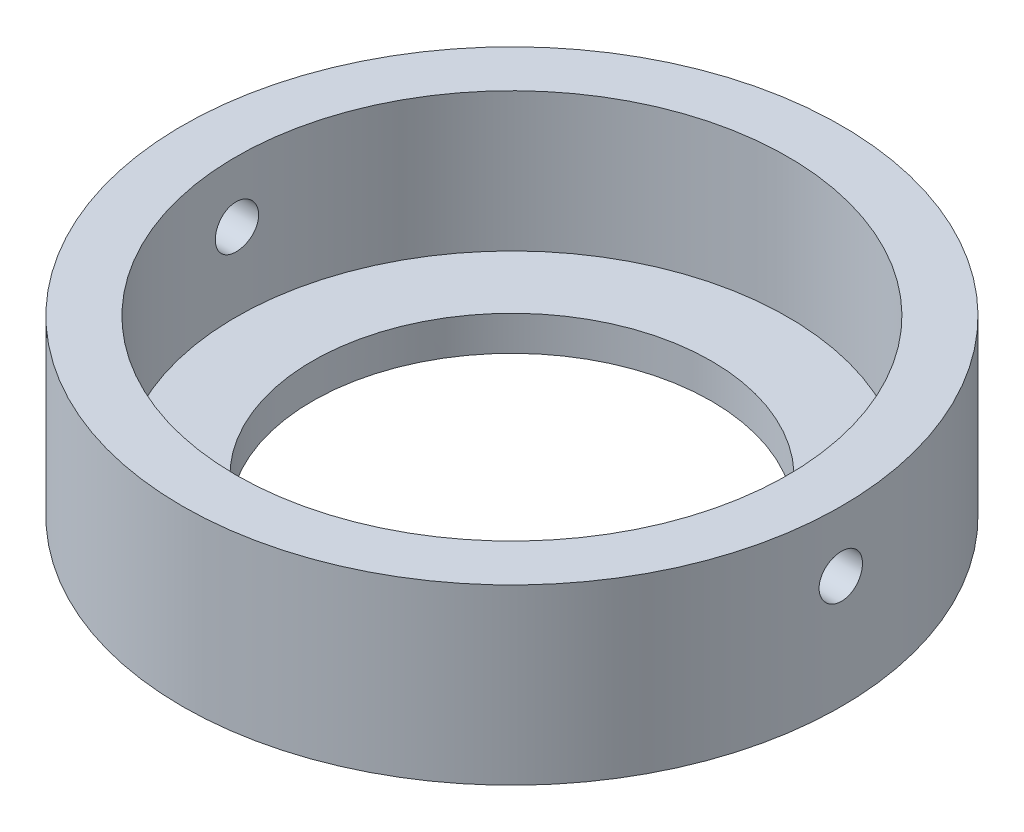
ISO-10303-21;
HEADER;
FILE_DESCRIPTION(('STEP AP214'),'2;1');
FILE_NAME('part.step','',(''),(''),'','','');
FILE_SCHEMA(('AUTOMOTIVE_DESIGN { 1 0 10303 214 1 1 1 1 }'));
ENDSEC;
DATA;
#1=APPLICATION_CONTEXT('core data for automotive mechanical design processes');
#2=APPLICATION_PROTOCOL_DEFINITION('international standard','automotive_design',2000,#1);
#3=PRODUCT_CONTEXT('',#1,'mechanical');
#4=PRODUCT('Part','Part','',(#3));
#5=PRODUCT_RELATED_PRODUCT_CATEGORY('part','',(#4));
#6=PRODUCT_DEFINITION_FORMATION('','',#4);
#7=PRODUCT_DEFINITION_CONTEXT('part definition',#1,'design');
#8=PRODUCT_DEFINITION('design','',#6,#7);
#9=PRODUCT_DEFINITION_SHAPE('','',#8);
#10=(LENGTH_UNIT() NAMED_UNIT(*) SI_UNIT(.MILLI.,.METRE.));
#11=(NAMED_UNIT(*) PLANE_ANGLE_UNIT() SI_UNIT($,.RADIAN.));
#12=(NAMED_UNIT(*) SI_UNIT($,.STERADIAN.) SOLID_ANGLE_UNIT());
#13=UNCERTAINTY_MEASURE_WITH_UNIT(LENGTH_MEASURE(1.E-05),#10,'distance_accuracy_value','');
#14=(GEOMETRIC_REPRESENTATION_CONTEXT(3) GLOBAL_UNCERTAINTY_ASSIGNED_CONTEXT((#13)) GLOBAL_UNIT_ASSIGNED_CONTEXT((#10,
#11,#12)) REPRESENTATION_CONTEXT('',''));
#15=CARTESIAN_POINT('',(0.,0.,0.));
#16=DIRECTION('',(0.,0.,1.));
#17=DIRECTION('',(1.,0.,0.));
#18=AXIS2_PLACEMENT_3D('',#15,#16,#17);
#19=CARTESIAN_POINT('',(0.,2.,0.));
#20=DIRECTION('',(0.,-1.,0.));
#21=DIRECTION('',(0.,0.,-1.));
#22=AXIS2_PLACEMENT_3D('',#19,#20,#21);
#23=CYLINDRICAL_SURFACE('',#22,19.);
#24=CARTESIAN_POINT('',(18.9588369896468,6.5,1.24999999999999));
#25=CARTESIAN_POINT('',(18.9588375396088,6.57013148410964,1.24999691698055));
#26=CARTESIAN_POINT('',(18.9592303148243,6.64031188548215,1.24407805299881));
#27=CARTESIAN_POINT('',(18.9607591328196,6.77873428538638,1.22055180266377));
#28=CARTESIAN_POINT('',(18.9618960375227,6.84697394019587,1.20293086147641));
#29=CARTESIAN_POINT('',(18.9647837839129,6.9794897783657,1.1565092682008));
#30=CARTESIAN_POINT('',(18.9665342981522,7.04376805421409,1.12771457801599));
#31=CARTESIAN_POINT('',(18.9704516079821,7.16656232997985,1.05977264730639));
#32=CARTESIAN_POINT('',(18.9726183091025,7.22507963302704,1.02062775541117));
#33=CARTESIAN_POINT('',(18.9771278975969,7.33480407260864,0.9330259586646));
#34=CARTESIAN_POINT('',(18.9794710371753,7.38600042957064,0.884555563854293));
#35=CARTESIAN_POINT('',(18.984067145466,7.47953738585654,0.779706632804728));
#36=CARTESIAN_POINT('',(18.9863201103897,7.52187761340709,0.723327764739887));
#37=CARTESIAN_POINT('',(18.9904842240195,7.59653392936497,0.604200969092946));
#38=CARTESIAN_POINT('',(18.9923950661852,7.6288410469995,0.541447407929066));
#39=CARTESIAN_POINT('',(18.9956569629665,7.68245663362515,0.411392049451877));
#40=CARTESIAN_POINT('',(18.9970080241015,7.70376523070846,0.344090305118454));
#41=CARTESIAN_POINT('',(18.998996383403,7.73474885133426,0.206953324972159));
#42=CARTESIAN_POINT('',(18.9996347217425,7.74444083010752,0.137121935206073));
#43=CARTESIAN_POINT('',(19.0001292164116,7.75196846233493,-0.00317924369410391));
#44=CARTESIAN_POINT('',(18.9999853823551,7.74980426151517,-0.0736490249710013));
#45=CARTESIAN_POINT('',(18.9989326057468,7.73369493743142,-0.213111746980412));
#46=CARTESIAN_POINT('',(18.9980248476562,7.71976805204224,-0.282106804548808));
#47=CARTESIAN_POINT('',(18.9955477714651,7.68055700174088,-0.416777761157238));
#48=CARTESIAN_POINT('',(18.9939784491166,7.65527276390538,-0.482453638882459));
#49=CARTESIAN_POINT('',(18.9903528796175,7.59404412894595,-0.608680412720544));
#50=CARTESIAN_POINT('',(18.98829625581,7.55809148028618,-0.669227295016875));
#51=CARTESIAN_POINT('',(18.9839274937888,7.47655258861317,-0.783433543890818));
#52=CARTESIAN_POINT('',(18.9816153523789,7.43096622508746,-0.837092824294812));
#53=CARTESIAN_POINT('',(18.9769905476197,7.33135095910624,-0.936107153052133));
#54=CARTESIAN_POINT('',(18.9746778915818,7.27730622437404,-0.981446274902408));
#55=CARTESIAN_POINT('',(18.970317163269,7.1623637752548,-1.06241044516599));
#56=CARTESIAN_POINT('',(18.9682690911121,7.10146605781396,-1.0980354892505));
#57=CARTESIAN_POINT('',(18.964668845539,6.9745360356885,-1.15855917855933));
#58=CARTESIAN_POINT('',(18.9631167041369,6.90850339986849,-1.18345713134759));
#59=CARTESIAN_POINT('',(18.9606844759929,6.77318270284996,-1.22180877024509));
#60=CARTESIAN_POINT('',(18.9598043804859,6.70389468412224,-1.23526260561433));
#61=CARTESIAN_POINT('',(18.9588171416418,6.56416903948201,-1.25032421791206));
#62=CARTESIAN_POINT('',(18.9587085531268,6.49373381081816,-1.25195414337159));
#63=CARTESIAN_POINT('',(18.9592727977804,6.35359097983463,-1.24337955784981));
#64=CARTESIAN_POINT('',(18.9599456264371,6.28388337331601,-1.23317511520025));
#65=CARTESIAN_POINT('',(18.9619955645894,6.14723729481512,-1.20123986779917));
#66=CARTESIAN_POINT('',(18.963372049623,6.08029642432118,-1.17951928244908));
#67=CARTESIAN_POINT('',(18.9666736573975,5.95100995516739,-1.12517867380962));
#68=CARTESIAN_POINT('',(18.9685987856506,5.88866440268511,-1.09255854101074));
#69=CARTESIAN_POINT('',(18.9727842462309,5.77023664657834,-1.01728828167363));
#70=CARTESIAN_POINT('',(18.9750450723162,5.7141638859254,-0.974623325732559));
#71=CARTESIAN_POINT('',(18.9796454413481,5.6099685822142,-0.880496081652914));
#72=CARTESIAN_POINT('',(18.9819849851459,5.56184612515927,-0.829033698359408));
#73=CARTESIAN_POINT('',(18.9864833988913,5.47484252619028,-0.71867704968889));
#74=CARTESIAN_POINT('',(18.9886419851557,5.43597572487409,-0.659771465254633));
#75=CARTESIAN_POINT('',(18.9925311801518,5.36868489103533,-0.536257375811505));
#76=CARTESIAN_POINT('',(18.9942617917539,5.34026078847091,-0.471648909056937));
#77=CARTESIAN_POINT('',(18.9970986926279,5.2946871087704,-0.338615587581912));
#78=CARTESIAN_POINT('',(18.9982054827766,5.27752848456221,-0.270193843255301));
#79=CARTESIAN_POINT('',(18.9996720348125,5.25494322959253,-0.131433046477445));
#80=CARTESIAN_POINT('',(19.000031804991,5.24951646861575,-0.0610940153154893));
#81=CARTESIAN_POINT('',(18.9999638037838,5.2505502787395,0.0793628308777346));
#82=CARTESIAN_POINT('',(18.9995375183576,5.25698842041218,0.149480812817942));
#83=CARTESIAN_POINT('',(18.9979482842031,5.28152273833978,0.287637803133685));
#84=CARTESIAN_POINT('',(18.996785334213,5.29961893456426,0.355676807947845));
#85=CARTESIAN_POINT('',(18.9938534516233,5.34695051494484,0.487747547886215));
#86=CARTESIAN_POINT('',(18.9920845266476,5.37618575896041,0.551779333413506));
#87=CARTESIAN_POINT('',(18.9881392048471,5.44496254986691,0.67402868902541));
#88=CARTESIAN_POINT('',(18.9859628180138,5.48450384404986,0.732246401624724));
#89=CARTESIAN_POINT('',(18.9814424191099,5.57285351594977,0.841329014255547));
#90=CARTESIAN_POINT('',(18.9790981168421,5.62167819073545,0.892180702337157));
#91=CARTESIAN_POINT('',(18.9745084582332,5.72718521529731,0.984984167349629));
#92=CARTESIAN_POINT('',(18.9722631262104,5.78386948225164,1.02693376647075));
#93=CARTESIAN_POINT('',(18.9681223184561,5.9035575904423,1.10077681645825));
#94=CARTESIAN_POINT('',(18.9662273109671,5.96656971844572,1.13265684810675));
#95=CARTESIAN_POINT('',(18.9630076611085,6.09701928150291,1.18534540776379));
#96=CARTESIAN_POINT('',(18.9616823527565,6.16445144259464,1.20616687006853));
#97=CARTESIAN_POINT('',(18.9600985946234,6.27691181079718,1.23075057711041));
#98=CARTESIAN_POINT('',(18.9596276152415,6.3212135446496,1.23795974025141));
#99=CARTESIAN_POINT('',(18.9589966371749,6.41033685337026,1.24758543358804));
#100=CARTESIAN_POINT('',(18.958836638005,6.45515842742738,1.25000197126071));
#101=CARTESIAN_POINT('',(18.9588369896468,6.5,1.24999999999999));
#102=B_SPLINE_CURVE_WITH_KNOTS('',3,(#24,#25,#26,#27,#28,#29,#30,#31,#32,#33,#34,#35,#36,#37,
#38,#39,#40,#41,#42,#43,#44,#45,#46,#47,#48,#49,#50,#51,#52,#53,#54,#55,#56,#57,#58,#59,#60,#61,
#62,#63,#64,#65,#66,#67,#68,#69,#70,#71,#72,#73,#74,#75,#76,#77,#78,#79,#80,#81,#82,#83,#84,#85,
#86,#87,#88,#89,#90,#91,#92,#93,#94,#95,#96,#97,#98,#99,#100,#101),.UNSPECIFIED.,.T.,.F.,(4,2,2,
2,2,2,2,2,2,2,2,2,2,2,2,2,2,2,2,2,2,2,2,2,2,2,2,2,2,2,2,2,2,2,2,2,2,2,4),(0.,0.210230749240217,
0.420705440205018,0.631067983651484,0.841382833311276,1.05200423643321,1.26263447950241,
1.47345251198605,1.68426808916168,1.89477559074736,2.1052805049597,2.31545963219809,
2.52564010897453,2.73598357652074,2.94632967550407,3.15707431337854,3.36781904516507,
3.57857737853193,3.78933296303909,3.9996936583017,4.21005313894565,4.42022625868903,
4.63040149013909,4.84088897562352,5.0513787379314,5.26219253891799,5.47300492589643,
5.68364780605834,5.89428834822283,6.10453110361536,6.31477421914261,6.52501468968572,
6.73525000554354,6.94585785736152,7.15651717310201,7.36745605113516,7.57814766499504,
7.71256792183232,7.84698796895856),.UNSPECIFIED.);
#103=CARTESIAN_POINT('',(18.9588369896468,6.5,1.24999999999999));
#104=VERTEX_POINT('',#103);
#105=EDGE_CURVE('E74',#104,#104,#102,.T.);
#106=ORIENTED_EDGE('',*,*,#105,.T.);
#107=EDGE_LOOP('',(#106));
#108=FACE_BOUND('',#107,.T.);
#109=CARTESIAN_POINT('',(-18.9705689319611,5.4420718434515,-1.05712555593429));
#110=CARTESIAN_POINT('',(-18.9677662861485,5.49629419312282,-1.10742192407926));
#111=CARTESIAN_POINT('',(-18.9649856856747,5.55424974257248,-1.15372164064828));
#112=CARTESIAN_POINT('',(-18.9597054284623,5.6762917727867,-1.23747134811881));
#113=CARTESIAN_POINT('',(-18.9572060217674,5.74038361781009,-1.27491349478546));
#114=CARTESIAN_POINT('',(-18.9523418330472,5.88380851707577,-1.34543206744556));
#115=CARTESIAN_POINT('',(-18.950060760891,5.96394945499014,-1.37688323319947));
#116=CARTESIAN_POINT('',(-18.946407466982,6.12831756667747,-1.42627496104311));
#117=CARTESIAN_POINT('',(-18.9450355416123,6.21254606340576,-1.44421111748194));
#118=CARTESIAN_POINT('',(-18.9433280446038,6.38486276047511,-1.46644259220615));
#119=CARTESIAN_POINT('',(-18.9430181798103,6.47299507061716,-1.4703996185725));
#120=CARTESIAN_POINT('',(-18.9435417507761,6.64869138735992,-1.46363798036328));
#121=CARTESIAN_POINT('',(-18.9443752213083,6.73625537659461,-1.45291886943484));
#122=CARTESIAN_POINT('',(-18.9471033256541,6.90906859753269,-1.4168988095983));
#123=CARTESIAN_POINT('',(-18.9490065603693,6.99429311993968,-1.39147962367509));
#124=CARTESIAN_POINT('',(-18.95366169911,7.15918467850104,-1.32655989389024));
#125=CARTESIAN_POINT('',(-18.9564135985352,7.23885174477815,-1.28705942635961));
#126=CARTESIAN_POINT('',(-18.9624083110717,7.3893248717607,-1.19546860954792));
#127=CARTESIAN_POINT('',(-18.9656451423692,7.4602219473328,-1.14352759475739));
#128=CARTESIAN_POINT('',(-18.972249627804,7.59194148228924,-1.02814006320633));
#129=CARTESIAN_POINT('',(-18.9756172615079,7.65276550748841,-0.964695337868967));
#130=CARTESIAN_POINT('',(-18.9819747960724,7.76061528303371,-0.830077588310768));
#131=CARTESIAN_POINT('',(-18.9849729686818,7.8079985472216,-0.759191593005472));
#132=CARTESIAN_POINT('',(-18.9903446765614,7.88964803874912,-0.610205994967871));
#133=CARTESIAN_POINT('',(-18.9927183687512,7.92391756230036,-0.532108211093195));
#134=CARTESIAN_POINT('',(-18.996473868298,7.97701625637805,-0.374138356340968));
#135=CARTESIAN_POINT('',(-18.9978901916986,7.99638666202069,-0.29444888578762));
#136=CARTESIAN_POINT('',(-18.9997065671621,8.0210966356126,-0.132915776110981));
#137=CARTESIAN_POINT('',(-19.0001068096528,8.02643883265223,-0.0510725435384692));
#138=CARTESIAN_POINT('',(-18.9998474013877,8.02294485683122,0.110102157462777));
#139=CARTESIAN_POINT('',(-18.9992158853331,8.0144850551604,0.189442127310823));
#140=CARTESIAN_POINT('',(-18.9970177045635,7.98439908761366,0.345565332881491));
#141=CARTESIAN_POINT('',(-18.9954510646597,7.96277327106536,0.422348636381925));
#142=CARTESIAN_POINT('',(-18.9915558362146,7.9070880838567,0.571284456042974));
#143=CARTESIAN_POINT('',(-18.989226806353,7.8730215103632,0.643434261031799));
#144=CARTESIAN_POINT('',(-18.9840594564712,7.79357358859691,0.781181618972696));
#145=CARTESIAN_POINT('',(-18.9812210803858,7.74819099452063,0.846778449380169));
#146=CARTESIAN_POINT('',(-18.9752538090447,7.64615206413419,0.971467135948675));
#147=CARTESIAN_POINT('',(-18.9721191877792,7.58922754279029,1.03033907834171));
#148=CARTESIAN_POINT('',(-18.9659599443625,7.46660930180564,1.13810547232383));
#149=CARTESIAN_POINT('',(-18.9629353415514,7.40091404976447,1.18699817658157));
#150=CARTESIAN_POINT('',(-18.9572030208753,7.25999572016471,1.27534008311509));
#151=CARTESIAN_POINT('',(-18.9545113011066,7.1845089103943,1.31436973826795));
#152=CARTESIAN_POINT('',(-18.9498714881824,7.02817913579579,1.37965427223562));
#153=CARTESIAN_POINT('',(-18.9479235166329,6.94733529760507,1.40590706217253));
#154=CARTESIAN_POINT('',(-18.9449321895507,6.77993299630997,1.44566918938653));
#155=CARTESIAN_POINT('',(-18.9439183365141,6.69327536668518,1.45876403358614));
#156=CARTESIAN_POINT('',(-18.9430120165431,6.51897794862135,1.47048645574347));
#157=CARTESIAN_POINT('',(-18.9431196667616,6.43133805852998,1.46911252228368));
#158=CARTESIAN_POINT('',(-18.9444542089947,6.25625845094541,1.45180271502945));
#159=CARTESIAN_POINT('',(-18.9456968913864,6.16883905256669,1.43566139457929));
#160=CARTESIAN_POINT('',(-18.9491824608535,5.99797698615774,1.38889501058114));
#161=CARTESIAN_POINT('',(-18.9514253663719,5.91453439148662,1.35826967996391));
#162=CARTESIAN_POINT('',(-18.9566384198646,5.75451050542352,1.28345325843521));
#163=CARTESIAN_POINT('',(-18.9596047529666,5.67789601076512,1.23933303004397));
#164=CARTESIAN_POINT('',(-18.9659227927169,5.53341626197766,1.13855687277488));
#165=CARTESIAN_POINT('',(-18.9692744583861,5.465550079111,1.0819022763071));
#166=CARTESIAN_POINT('',(-18.9758756792714,5.34234017881964,0.959073911477654));
#167=CARTESIAN_POINT('',(-18.9791257254322,5.28673055711979,0.893167156626319));
#168=CARTESIAN_POINT('',(-18.9852173322174,5.18787682809751,0.752632409632592));
#169=CARTESIAN_POINT('',(-18.9880589881408,5.14462983358516,0.678006459531128));
#170=CARTESIAN_POINT('',(-18.9928892177543,5.07345086929805,0.525148654074515));
#171=CARTESIAN_POINT('',(-18.9949057529763,5.04500602412726,0.447156489046599));
#172=CARTESIAN_POINT('',(-18.9979938483914,5.0020872555964,0.28740452763545));
#173=CARTESIAN_POINT('',(-18.9990656431229,4.98760986463247,0.205645671666527));
#174=CARTESIAN_POINT('',(-19.0001172631899,4.97340707144413,0.043564162395857));
#175=CARTESIAN_POINT('',(-19.0001317840648,4.97321294672758,-0.0367175157280905));
#176=CARTESIAN_POINT('',(-18.9991546434706,4.98640603786591,-0.196157983436857));
#177=CARTESIAN_POINT('',(-18.9981629176488,4.99979412234595,-0.275316700876487));
#178=CARTESIAN_POINT('',(-18.995299006671,5.03949488325817,-0.429560107299692));
#179=CARTESIAN_POINT('',(-18.9934345040151,5.0656948727547,-0.504674090640115));
#180=CARTESIAN_POINT('',(-18.9890332129628,5.13007362317762,-0.649512260647918));
#181=CARTESIAN_POINT('',(-18.9864968344493,5.16824508342114,-0.719239700031817));
#182=CARTESIAN_POINT('',(-18.9817033777832,5.24450175640642,-0.835120297419386));
#183=CARTESIAN_POINT('',(-18.9795331116262,5.28025910019073,-0.882830448582407));
#184=CARTESIAN_POINT('',(-18.9750934320603,5.35723021485121,-0.973597285307051));
#185=CARTESIAN_POINT('',(-18.9728240454795,5.39844251533769,-1.01665521921831));
#186=CARTESIAN_POINT('',(-18.9705689319611,5.4420718434515,-1.05712555593429));
#187=B_SPLINE_CURVE_WITH_KNOTS('',3,(#109,#110,#111,#112,#113,#114,#115,#116,#117,#118,#119,
#120,#121,#122,#123,#124,#125,#126,#127,#128,#129,#130,#131,#132,#133,#134,#135,#136,#137,#138,
#139,#140,#141,#142,#143,#144,#145,#146,#147,#148,#149,#150,#151,#152,#153,#154,#155,#156,#157,
#158,#159,#160,#161,#162,#163,#164,#165,#166,#167,#168,#169,#170,#171,#172,#173,#174,#175,#176,
#177,#178,#179,#180,#181,#182,#183,#184,#185,#186),.UNSPECIFIED.,.T.,.F.,(4,2,2,2,2,2,2,2,2,2,2,
2,2,2,2,2,2,2,2,2,2,2,2,2,2,2,2,2,2,2,2,2,2,2,2,2,2,2,4),(0.,0.221867608989586,
0.443930973751528,0.70109091406853,0.958334647695458,1.22176252914999,1.48519842254936,
1.75078327546906,2.01636668874321,2.2789091377999,2.54141073731358,2.79608102928326,
3.05068726634647,3.29553931858209,3.54034547870519,3.77858681841761,4.01682183726083,
4.2551950064319,4.49359443018072,4.73834643242589,4.98314125323631,5.23705346500419,
5.49100717471228,5.7527311841889,6.01448253378954,6.27993172262785,6.5453858062485,
6.80946923314762,7.07352460131268,7.33111519039006,7.58864557206359,7.83653183040895,
8.08435653188842,8.32404481509757,8.5637484280956,8.80138065485581,9.03886824482772,
9.21743924762483,9.39596221406046),.UNSPECIFIED.);
#188=CARTESIAN_POINT('',(-18.9705689319611,5.4420718434515,-1.05712555593429));
#189=VERTEX_POINT('',#188);
#190=EDGE_CURVE('E10',#189,#189,#187,.T.);
#191=ORIENTED_EDGE('',*,*,#190,.T.);
#192=EDGE_LOOP('',(#191));
#193=FACE_BOUND('',#192,.T.);
#194=CARTESIAN_POINT('',(0.,0.,0.));
#195=DIRECTION('',(0.,1.,0.));
#196=DIRECTION('',(0.,0.,1.));
#197=AXIS2_PLACEMENT_3D('',#194,#195,#196);
#198=CIRCLE('',#197,19.);
#199=CARTESIAN_POINT('',(0.,0.,19.));
#200=VERTEX_POINT('',#199);
#201=EDGE_CURVE('E65',#200,#200,#198,.T.);
#202=ORIENTED_EDGE('',*,*,#201,.T.);
#203=EDGE_LOOP('',(#202));
#204=FACE_BOUND('',#203,.T.);
#205=CARTESIAN_POINT('',(0.,10.,0.));
#206=DIRECTION('',(0.,1.,0.));
#207=DIRECTION('',(0.,0.,1.));
#208=AXIS2_PLACEMENT_3D('',#205,#206,#207);
#209=CIRCLE('',#208,19.);
#210=CARTESIAN_POINT('',(0.,10.,19.));
#211=VERTEX_POINT('',#210);
#212=EDGE_CURVE('E124',#211,#211,#209,.T.);
#213=ORIENTED_EDGE('',*,*,#212,.F.);
#214=EDGE_LOOP('',(#213));
#215=FACE_BOUND('',#214,.T.);
#216=ADVANCED_FACE('F47',(#108,#193,#204,#215),#23,.T.);
#217=CARTESIAN_POINT('',(0.,0.,0.));
#218=DIRECTION('',(0.,1.,0.));
#219=DIRECTION('',(0.,0.,1.));
#220=AXIS2_PLACEMENT_3D('',#217,#218,#219);
#221=PLANE('',#220);
#222=CARTESIAN_POINT('',(0.,0.,0.));
#223=DIRECTION('',(0.,-1.,0.));
#224=DIRECTION('',(0.,0.,-1.));
#225=AXIS2_PLACEMENT_3D('',#222,#223,#224);
#226=CIRCLE('',#225,11.5);
#227=CARTESIAN_POINT('',(0.,0.,-11.5));
#228=VERTEX_POINT('',#227);
#229=EDGE_CURVE('E120',#228,#228,#226,.T.);
#230=ORIENTED_EDGE('',*,*,#229,.F.);
#231=EDGE_LOOP('',(#230));
#232=FACE_BOUND('',#231,.T.);
#233=ORIENTED_EDGE('',*,*,#201,.F.);
#234=EDGE_LOOP('',(#233));
#235=FACE_BOUND('',#234,.T.);
#236=ADVANCED_FACE('F107',(#232,#235),#221,.F.);
#237=CARTESIAN_POINT('',(0.,10.,0.));
#238=DIRECTION('',(0.,1.,0.));
#239=DIRECTION('',(0.,0.,1.));
#240=AXIS2_PLACEMENT_3D('',#237,#238,#239);
#241=PLANE('',#240);
#242=ORIENTED_EDGE('',*,*,#212,.T.);
#243=EDGE_LOOP('',(#242));
#244=FACE_BOUND('',#243,.T.);
#245=CARTESIAN_POINT('',(0.,10.,0.));
#246=DIRECTION('',(0.,1.,0.));
#247=DIRECTION('',(0.,0.,1.));
#248=AXIS2_PLACEMENT_3D('',#245,#246,#247);
#249=CIRCLE('',#248,15.9);
#250=CARTESIAN_POINT('',(0.,10.,15.9));
#251=VERTEX_POINT('',#250);
#252=EDGE_CURVE('E127',#251,#251,#249,.T.);
#253=ORIENTED_EDGE('',*,*,#252,.F.);
#254=EDGE_LOOP('',(#253));
#255=FACE_BOUND('',#254,.T.);
#256=ADVANCED_FACE('F102',(#244,#255),#241,.T.);
#257=CARTESIAN_POINT('',(0.,10.,0.));
#258=DIRECTION('',(0.,-1.,0.));
#259=DIRECTION('',(0.,0.,-1.));
#260=AXIS2_PLACEMENT_3D('',#257,#258,#259);
#261=CYLINDRICAL_SURFACE('',#260,15.9);
#262=CARTESIAN_POINT('',(15.850788623914,6.5,1.24999999999999));
#263=CARTESIAN_POINT('',(15.8507892775509,6.57009654904745,1.24999693199842));
#264=CARTESIAN_POINT('',(15.851258607696,6.64024116123575,1.24408393783195));
#265=CARTESIAN_POINT('',(15.8530852592729,6.77859056865228,1.2205823682363));
#266=CARTESIAN_POINT('',(15.8544435937414,6.846793058165,1.20298047275567));
#267=CARTESIAN_POINT('',(15.8578934584565,6.97923437030207,1.15661243518489));
#268=CARTESIAN_POINT('',(15.8599845801773,7.04347537801721,1.12785251269174));
#269=CARTESIAN_POINT('',(15.8646638891021,7.16620247005758,1.05999563188118));
#270=CARTESIAN_POINT('',(15.8672519681117,7.224689802852,1.02090092289051));
#271=CARTESIAN_POINT('',(15.8726402705951,7.33439946949378,0.933386839971728));
#272=CARTESIAN_POINT('',(15.8754409155074,7.38560676039682,0.884948632141072));
#273=CARTESIAN_POINT('',(15.8809349147649,7.47917362066215,0.780162214149982));
#274=CARTESIAN_POINT('',(15.8836282644725,7.52153280793249,0.723813662568953));
#275=CARTESIAN_POINT('',(15.888608130452,7.59625036103549,0.604717276829065));
#276=CARTESIAN_POINT('',(15.8908941200573,7.62859581959447,0.541961321128374));
#277=CARTESIAN_POINT('',(15.8947971729871,7.68228517595658,0.411888260517852));
#278=CARTESIAN_POINT('',(15.8964142468742,7.70362924747982,0.344571227649829));
#279=CARTESIAN_POINT('',(15.8987943282346,7.73466694565362,0.20743574341475));
#280=CARTESIAN_POINT('',(15.8995591091811,7.74438476761767,0.137622799407209));
#281=CARTESIAN_POINT('',(15.900154436508,7.75196889078762,-0.00264720097783744));
#282=CARTESIAN_POINT('',(15.899984998544,7.74983539059707,-0.0731042465417852));
#283=CARTESIAN_POINT('',(15.8987324462377,7.73379725936984,-0.212498420542563));
#284=CARTESIAN_POINT('',(15.8976513515716,7.71991864810812,-0.281438563380013));
#285=CARTESIAN_POINT('',(15.8946994360907,7.6808246961776,-0.416007774964324));
#286=CARTESIAN_POINT('',(15.8928286084663,7.65560925775603,-0.481636815155484));
#287=CARTESIAN_POINT('',(15.8885042628265,7.59452830848651,-0.607803839070999));
#288=CARTESIAN_POINT('',(15.8860501059308,7.55865110969209,-0.66833614155307));
#289=CARTESIAN_POINT('',(15.8808349982898,7.47727355057846,-0.782529385540703));
#290=CARTESIAN_POINT('',(15.8780740420176,7.43177301688168,-0.836190203219086));
#291=CARTESIAN_POINT('',(15.8725469162686,7.3322936549504,-0.935269311613456));
#292=CARTESIAN_POINT('',(15.8697807528948,7.27829222360331,-0.980664911319715));
#293=CARTESIAN_POINT('',(15.8645625102126,7.16342284395011,-1.06174975372496));
#294=CARTESIAN_POINT('',(15.8621104311237,7.10255489084523,-1.09743898964047));
#295=CARTESIAN_POINT('',(15.857797474707,6.97566473121945,-1.15809696587496));
#296=CARTESIAN_POINT('',(15.8559366592466,6.9096419862225,-1.1830645844248));
#297=CARTESIAN_POINT('',(15.8530180557572,6.77432373705571,-1.2215540733645));
#298=CARTESIAN_POINT('',(15.8519602527251,6.70502829405704,-1.23507615759759));
#299=CARTESIAN_POINT('',(15.8507698129154,6.5653300901437,-1.25026212504303));
#300=CARTESIAN_POINT('',(15.8506347093907,6.49493078634763,-1.25195762573284));
#301=CARTESIAN_POINT('',(15.8512984516509,6.35484891331627,-1.24352506532475));
#302=CARTESIAN_POINT('',(15.8520972896962,6.28516633814627,-1.2333971022079));
#303=CARTESIAN_POINT('',(15.854536653126,6.14858638004995,-1.20163144454075));
#304=CARTESIAN_POINT('',(15.8561761029585,6.08168555587587,-1.1800084564282));
#305=CARTESIAN_POINT('',(15.8601110630625,5.95246166480059,-1.12588148211574));
#306=CARTESIAN_POINT('',(15.8624065827196,5.89013866340441,-1.09337734025209));
#307=CARTESIAN_POINT('',(15.8674010099352,5.77169471572673,-1.018330527039));
#308=CARTESIAN_POINT('',(15.8701007608834,5.71558717366725,-0.975766757208866));
#309=CARTESIAN_POINT('',(15.8755965726498,5.61130219377497,-0.881839447352912));
#310=CARTESIAN_POINT('',(15.8783926349443,5.56312487756407,-0.830475772392022));
#311=CARTESIAN_POINT('',(15.8837733327633,5.47596028632173,-0.720270186447689));
#312=CARTESIAN_POINT('',(15.8863574879341,5.43699353322656,-0.661412017440934));
#313=CARTESIAN_POINT('',(15.8910162898413,5.36949690201339,-0.537969402003479));
#314=CARTESIAN_POINT('',(15.8930909411855,5.34096692950606,-0.47338500736682));
#315=CARTESIAN_POINT('',(15.896494750056,5.29518907960065,-0.340397268952151));
#316=CARTESIAN_POINT('',(15.8978247508161,5.27792843724515,-0.271998341654827));
#317=CARTESIAN_POINT('',(15.8995928136544,5.25513747992788,-0.13326235344516));
#318=CARTESIAN_POINT('',(15.9000308905742,5.2496069697764,-0.0629253248026086));
#319=CARTESIAN_POINT('',(15.8999657756072,5.25043543649651,0.0774877710721056));
#320=CARTESIAN_POINT('',(15.899465118292,5.25676239830868,0.147564030605471));
#321=CARTESIAN_POINT('',(15.8975838139075,5.28105954223302,0.285655548271497));
#322=CARTESIAN_POINT('',(15.8962031655402,5.29902974151915,0.353670803363985));
#323=CARTESIAN_POINT('',(15.8927168534933,5.34609531980036,0.485712317249712));
#324=CARTESIAN_POINT('',(15.8906112208107,5.37519022316084,0.549738746448354));
#325=CARTESIAN_POINT('',(15.8859107200105,5.44367551842315,0.672003184878836));
#326=CARTESIAN_POINT('',(15.8833158608654,5.48306572151154,0.730241300239992));
#327=CARTESIAN_POINT('',(15.8779199769069,5.57114345530806,0.839439592740208));
#328=CARTESIAN_POINT('',(15.8751184398795,5.61985459673281,0.890380700288511));
#329=CARTESIAN_POINT('',(15.8696292832031,5.72515053966098,0.983383426108168));
#330=CARTESIAN_POINT('',(15.8669416913775,5.78173724994797,1.02544288551528));
#331=CARTESIAN_POINT('',(15.8619797086955,5.9012763364694,1.09953871623095));
#332=CARTESIAN_POINT('',(15.8597060329381,5.96423944226664,1.13155780902969));
#333=CARTESIAN_POINT('',(15.8558381242139,6.0946223224294,1.18452915846));
#334=CARTESIAN_POINT('',(15.8542431068227,6.16203684690874,1.20549419861606));
#335=CARTESIAN_POINT('',(15.8523252895834,6.27487741386696,1.23039514241354));
#336=CARTESIAN_POINT('',(15.8517516702379,6.3195767458562,1.23773725860678));
#337=CARTESIAN_POINT('',(15.8509831268513,6.409510708407,1.24754067204049));
#338=CARTESIAN_POINT('',(15.8507882019229,6.45474533771415,1.25000198071625));
#339=CARTESIAN_POINT('',(15.850788623914,6.5,1.24999999999999));
#340=B_SPLINE_CURVE_WITH_KNOTS('',3,(#262,#263,#264,#265,#266,#267,#268,#269,#270,#271,#272,
#273,#274,#275,#276,#277,#278,#279,#280,#281,#282,#283,#284,#285,#286,#287,#288,#289,#290,#291,
#292,#293,#294,#295,#296,#297,#298,#299,#300,#301,#302,#303,#304,#305,#306,#307,#308,#309,#310,
#311,#312,#313,#314,#315,#316,#317,#318,#319,#320,#321,#322,#323,#324,#325,#326,#327,#328,#329,
#330,#331,#332,#333,#334,#335,#336,#337,#338,#339),.UNSPECIFIED.,.T.,.F.,(4,2,2,2,2,2,2,2,2,2,2,
2,2,2,2,2,2,2,2,2,2,2,2,2,2,2,2,2,2,2,2,2,2,2,2,2,2,2,4),(0.,0.210124420478212,
0.420488699427558,0.630735887282972,0.840937353263645,1.0515670404181,1.26220582141706,
1.47311498725351,1.68402082257471,1.89448697535316,2.10494960116682,2.3149471911246,
2.52494659183971,2.73517705884202,2.94541131375683,3.15621430990459,3.36701745337563,
3.57784264714652,3.78866390186688,3.99892132512942,4.20917700600082,4.41916433627672,
4.62915467071999,4.8395893974827,5.05002735127644,5.26092985020116,5.47183044169515,
5.68249172621114,5.8931495052899,6.10323932967321,6.31332946394328,6.52341061685416,
6.73348791719512,6.94410457923341,7.15477237713275,7.36580074939184,7.57658453838491,
7.71224217196359,7.84789948770841),.UNSPECIFIED.);
#341=CARTESIAN_POINT('',(15.850788623914,6.5,1.24999999999999));
#342=VERTEX_POINT('',#341);
#343=EDGE_CURVE('E51',#342,#342,#340,.T.);
#344=ORIENTED_EDGE('',*,*,#343,.F.);
#345=EDGE_LOOP('',(#344));
#346=FACE_BOUND('',#345,.T.);
#347=CARTESIAN_POINT('',(-15.850788623914,6.5,1.24999999999999));
#348=CARTESIAN_POINT('',(-15.8507892775509,6.42990345095255,1.24999693199843));
#349=CARTESIAN_POINT('',(-15.851258607696,6.35975883876425,1.24408393783196));
#350=CARTESIAN_POINT('',(-15.8530852592729,6.22140943134772,1.22058236823631));
#351=CARTESIAN_POINT('',(-15.8544435937414,6.153206941835,1.20298047275568));
#352=CARTESIAN_POINT('',(-15.8578934584565,6.02076562969793,1.15661243518489));
#353=CARTESIAN_POINT('',(-15.8599845801773,5.95652462198279,1.12785251269174));
#354=CARTESIAN_POINT('',(-15.8646638891021,5.83379752994242,1.05999563188119));
#355=CARTESIAN_POINT('',(-15.8672519681117,5.775310197148,1.02090092289051));
#356=CARTESIAN_POINT('',(-15.8726402705951,5.66560053050622,0.933386839971734));
#357=CARTESIAN_POINT('',(-15.8754409155074,5.61439323960318,0.884948632141077));
#358=CARTESIAN_POINT('',(-15.8809349147649,5.52082637933785,0.780162214149988));
#359=CARTESIAN_POINT('',(-15.8836282644725,5.47846719206752,0.723813662568959));
#360=CARTESIAN_POINT('',(-15.888608130452,5.40374963896451,0.604717276829071));
#361=CARTESIAN_POINT('',(-15.8908941200573,5.37140418040553,0.54196132112838));
#362=CARTESIAN_POINT('',(-15.8947971729871,5.31771482404342,0.411888260517858));
#363=CARTESIAN_POINT('',(-15.8964142468742,5.29637075252019,0.344571227649834));
#364=CARTESIAN_POINT('',(-15.8987943282346,5.26533305434638,0.207435743414755));
#365=CARTESIAN_POINT('',(-15.8995591091811,5.25561523238233,0.137622799407215));
#366=CARTESIAN_POINT('',(-15.900154436508,5.24803110921238,-0.00264720097783155));
#367=CARTESIAN_POINT('',(-15.899984998544,5.25016460940293,-0.0731042465417793));
#368=CARTESIAN_POINT('',(-15.8987324462377,5.26620274063016,-0.212498420542557));
#369=CARTESIAN_POINT('',(-15.8976513515716,5.28008135189188,-0.281438563380007));
#370=CARTESIAN_POINT('',(-15.8946994360907,5.3191753038224,-0.416007774964318));
#371=CARTESIAN_POINT('',(-15.8928286084663,5.34439074224397,-0.481636815155478));
#372=CARTESIAN_POINT('',(-15.8885042628265,5.40547169151349,-0.607803839070993));
#373=CARTESIAN_POINT('',(-15.8860501059308,5.44134889030791,-0.668336141553065));
#374=CARTESIAN_POINT('',(-15.8808349982898,5.52272644942154,-0.782529385540697));
#375=CARTESIAN_POINT('',(-15.8780740420176,5.56822698311832,-0.83619020321908));
#376=CARTESIAN_POINT('',(-15.8725469162686,5.66770634504961,-0.93526931161345));
#377=CARTESIAN_POINT('',(-15.8697807528948,5.72170777639669,-0.980664911319709));
#378=CARTESIAN_POINT('',(-15.8645625102126,5.8365771560499,-1.06174975372495));
#379=CARTESIAN_POINT('',(-15.8621104311237,5.89744510915477,-1.09743898964046));
#380=CARTESIAN_POINT('',(-15.857797474707,6.02433526878055,-1.15809696587495));
#381=CARTESIAN_POINT('',(-15.8559366592466,6.0903580137775,-1.1830645844248));
#382=CARTESIAN_POINT('',(-15.8530180557572,6.22567626294429,-1.2215540733645));
#383=CARTESIAN_POINT('',(-15.8519602527251,6.29497170594296,-1.23507615759759));
#384=CARTESIAN_POINT('',(-15.8507698129154,6.4346699098563,-1.25026212504303));
#385=CARTESIAN_POINT('',(-15.8506347093907,6.50506921365237,-1.25195762573283));
#386=CARTESIAN_POINT('',(-15.8512984516509,6.64515108668373,-1.24352506532474));
#387=CARTESIAN_POINT('',(-15.8520972896962,6.71483366185373,-1.2333971022079));
#388=CARTESIAN_POINT('',(-15.854536653126,6.85141361995005,-1.20163144454074));
#389=CARTESIAN_POINT('',(-15.8561761029585,6.91831444412413,-1.1800084564282));
#390=CARTESIAN_POINT('',(-15.8601110630625,7.04753833519941,-1.12588148211573));
#391=CARTESIAN_POINT('',(-15.8624065827196,7.10986133659559,-1.09337734025208));
#392=CARTESIAN_POINT('',(-15.8674010099352,7.22830528427327,-1.018330527039));
#393=CARTESIAN_POINT('',(-15.8701007608834,7.28441282633275,-0.97576675720886));
#394=CARTESIAN_POINT('',(-15.8755965726498,7.38869780622503,-0.881839447352906));
#395=CARTESIAN_POINT('',(-15.8783926349443,7.43687512243593,-0.830475772392016));
#396=CARTESIAN_POINT('',(-15.8837733327633,7.52403971367827,-0.720270186447683));
#397=CARTESIAN_POINT('',(-15.8863574879341,7.56300646677344,-0.661412017440928));
#398=CARTESIAN_POINT('',(-15.8910162898413,7.63050309798661,-0.537969402003473));
#399=CARTESIAN_POINT('',(-15.8930909411855,7.65903307049394,-0.473385007366814));
#400=CARTESIAN_POINT('',(-15.896494750056,7.70481092039935,-0.340397268952146));
#401=CARTESIAN_POINT('',(-15.8978247508161,7.72207156275486,-0.271998341654821));
#402=CARTESIAN_POINT('',(-15.8995928136544,7.74486252007212,-0.133262353445154));
#403=CARTESIAN_POINT('',(-15.9000308905742,7.7503930302236,-0.062925324802603));
#404=CARTESIAN_POINT('',(-15.8999657756072,7.74956456350349,0.0774877710721112));
#405=CARTESIAN_POINT('',(-15.899465118292,7.74323760169132,0.147564030605477));
#406=CARTESIAN_POINT('',(-15.8975838139075,7.71894045776698,0.285655548271502));
#407=CARTESIAN_POINT('',(-15.8962031655402,7.70097025848085,0.35367080336399));
#408=CARTESIAN_POINT('',(-15.8927168534933,7.65390468019964,0.485712317249718));
#409=CARTESIAN_POINT('',(-15.8906112208107,7.62480977683916,0.549738746448359));
#410=CARTESIAN_POINT('',(-15.8859107200105,7.55632448157686,0.672003184878841));
#411=CARTESIAN_POINT('',(-15.8833158608654,7.51693427848847,0.730241300239998));
#412=CARTESIAN_POINT('',(-15.8779199769069,7.42885654469194,0.839439592740213));
#413=CARTESIAN_POINT('',(-15.8751184398795,7.3801454032672,0.890380700288517));
#414=CARTESIAN_POINT('',(-15.8696292832031,7.27484946033902,0.983383426108174));
#415=CARTESIAN_POINT('',(-15.8669416913775,7.21826275005203,1.02544288551528));
#416=CARTESIAN_POINT('',(-15.8619797086955,7.0987236635306,1.09953871623096));
#417=CARTESIAN_POINT('',(-15.8597060329381,7.03576055773336,1.1315578090297));
#418=CARTESIAN_POINT('',(-15.8558381242139,6.9053776775706,1.18452915846));
#419=CARTESIAN_POINT('',(-15.8542431068227,6.83796315309126,1.20549419861607));
#420=CARTESIAN_POINT('',(-15.8523252895834,6.72512258613304,1.23039514241354));
#421=CARTESIAN_POINT('',(-15.8517516702379,6.6804232541438,1.23773725860678));
#422=CARTESIAN_POINT('',(-15.8509831268513,6.590489291593,1.2475406720405));
#423=CARTESIAN_POINT('',(-15.8507882019229,6.54525466228585,1.25000198071626));
#424=CARTESIAN_POINT('',(-15.850788623914,6.5,1.24999999999999));
#425=B_SPLINE_CURVE_WITH_KNOTS('',3,(#347,#348,#349,#350,#351,#352,#353,#354,#355,#356,#357,
#358,#359,#360,#361,#362,#363,#364,#365,#366,#367,#368,#369,#370,#371,#372,#373,#374,#375,#376,
#377,#378,#379,#380,#381,#382,#383,#384,#385,#386,#387,#388,#389,#390,#391,#392,#393,#394,#395,
#396,#397,#398,#399,#400,#401,#402,#403,#404,#405,#406,#407,#408,#409,#410,#411,#412,#413,#414,
#415,#416,#417,#418,#419,#420,#421,#422,#423,#424),.UNSPECIFIED.,.T.,.F.,(4,2,2,2,2,2,2,2,2,2,2,
2,2,2,2,2,2,2,2,2,2,2,2,2,2,2,2,2,2,2,2,2,2,2,2,2,2,2,4),(0.,0.210124420478212,
0.420488699427558,0.630735887282973,0.840937353263645,1.0515670404181,1.26220582141706,
1.47311498725351,1.68402082257471,1.89448697535316,2.10494960116682,2.3149471911246,
2.52494659183971,2.73517705884202,2.94541131375683,3.15621430990459,3.36701745337563,
3.57784264714652,3.78866390186688,3.99892132512942,4.20917700600082,4.41916433627672,
4.62915467071999,4.8395893974827,5.05002735127644,5.26092985020116,5.47183044169515,
5.68249172621114,5.8931495052899,6.10323932967321,6.31332946394328,6.52341061685416,
6.73348791719512,6.94410457923341,7.15477237713276,7.36580074939184,7.57658453838491,
7.71224217196359,7.84789948770841),.UNSPECIFIED.);
#426=CARTESIAN_POINT('',(-15.850788623914,6.5,1.24999999999999));
#427=VERTEX_POINT('',#426);
#428=EDGE_CURVE('E91',#427,#427,#425,.T.);
#429=ORIENTED_EDGE('',*,*,#428,.F.);
#430=EDGE_LOOP('',(#429));
#431=FACE_BOUND('',#430,.T.);
#432=ORIENTED_EDGE('',*,*,#252,.T.);
#433=EDGE_LOOP('',(#432));
#434=FACE_BOUND('',#433,.T.);
#435=CARTESIAN_POINT('',(0.,2.,0.));
#436=DIRECTION('',(0.,1.,0.));
#437=DIRECTION('',(0.,0.,1.));
#438=AXIS2_PLACEMENT_3D('',#435,#436,#437);
#439=CIRCLE('',#438,15.9);
#440=CARTESIAN_POINT('',(0.,2.,15.9));
#441=VERTEX_POINT('',#440);
#442=EDGE_CURVE('E60',#441,#441,#439,.F.);
#443=ORIENTED_EDGE('',*,*,#442,.T.);
#444=EDGE_LOOP('',(#443));
#445=FACE_BOUND('',#444,.T.);
#446=ADVANCED_FACE('F97',(#346,#431,#434,#445),#261,.F.);
#447=CARTESIAN_POINT('',(0.,2.,0.));
#448=DIRECTION('',(0.,1.,0.));
#449=DIRECTION('',(0.,0.,1.));
#450=AXIS2_PLACEMENT_3D('',#447,#448,#449);
#451=PLANE('',#450);
#452=CARTESIAN_POINT('',(0.,2.,0.));
#453=DIRECTION('',(0.,1.,0.));
#454=DIRECTION('',(0.,0.,1.));
#455=AXIS2_PLACEMENT_3D('',#452,#453,#454);
#456=CIRCLE('',#455,11.5);
#457=CARTESIAN_POINT('',(0.,2.,11.5));
#458=VERTEX_POINT('',#457);
#459=EDGE_CURVE('E73',#458,#458,#456,.T.);
#460=ORIENTED_EDGE('',*,*,#459,.F.);
#461=EDGE_LOOP('',(#460));
#462=FACE_BOUND('',#461,.T.);
#463=ORIENTED_EDGE('',*,*,#442,.F.);
#464=EDGE_LOOP('',(#463));
#465=FACE_BOUND('',#464,.T.);
#466=ADVANCED_FACE('F101',(#462,#465),#451,.T.);
#467=CARTESIAN_POINT('',(0.,6.,0.));
#468=DIRECTION('',(0.,-1.,0.));
#469=DIRECTION('',(0.,0.,-1.));
#470=AXIS2_PLACEMENT_3D('',#467,#468,#469);
#471=CYLINDRICAL_SURFACE('',#470,11.5);
#472=ORIENTED_EDGE('',*,*,#459,.T.);
#473=EDGE_LOOP('',(#472));
#474=FACE_BOUND('',#473,.T.);
#475=ORIENTED_EDGE('',*,*,#229,.T.);
#476=EDGE_LOOP('',(#475));
#477=FACE_BOUND('',#476,.T.);
#478=ADVANCED_FACE('F82',(#474,#477),#471,.F.);
#479=CARTESIAN_POINT('',(-19.,6.5,0.));
#480=DIRECTION('',(-1.,0.,0.));
#481=DIRECTION('',(0.,0.,1.));
#482=AXIS2_PLACEMENT_3D('',#479,#480,#481);
#483=CONICAL_SURFACE('',#482,1.525,0.785398163397442);
#484=CARTESIAN_POINT('',(-18.725,6.5,0.));
#485=DIRECTION('',(-1.,0.,0.));
#486=DIRECTION('',(0.,0.,1.));
#487=AXIS2_PLACEMENT_3D('',#484,#485,#486);
#488=CIRCLE('',#487,1.25);
#489=CARTESIAN_POINT('',(-18.725,6.5,1.25));
#490=VERTEX_POINT('',#489);
#491=EDGE_CURVE('E96',#490,#490,#488,.T.);
#492=ORIENTED_EDGE('',*,*,#491,.F.);
#493=EDGE_LOOP('',(#492));
#494=FACE_BOUND('',#493,.T.);
#495=ORIENTED_EDGE('',*,*,#190,.F.);
#496=EDGE_LOOP('',(#495));
#497=FACE_BOUND('',#496,.T.);
#498=ADVANCED_FACE('F78',(#494,#497),#483,.F.);
#499=CARTESIAN_POINT('',(-19.,6.5,0.));
#500=DIRECTION('',(-1.,0.,0.));
#501=DIRECTION('',(0.,0.,1.));
#502=AXIS2_PLACEMENT_3D('',#499,#500,#501);
#503=CYLINDRICAL_SURFACE('',#502,1.25);
#504=ORIENTED_EDGE('',*,*,#428,.T.);
#505=EDGE_LOOP('',(#504));
#506=FACE_BOUND('',#505,.T.);
#507=ORIENTED_EDGE('',*,*,#491,.T.);
#508=EDGE_LOOP('',(#507));
#509=FACE_BOUND('',#508,.T.);
#510=ADVANCED_FACE('F81',(#506,#509),#503,.F.);
#511=ORIENTED_EDGE('',*,*,#343,.T.);
#512=EDGE_LOOP('',(#511));
#513=FACE_BOUND('',#512,.T.);
#514=ORIENTED_EDGE('',*,*,#105,.F.);
#515=EDGE_LOOP('',(#514));
#516=FACE_BOUND('',#515,.T.);
#517=ADVANCED_FACE('F87',(#513,#516),#503,.F.);
#518=CLOSED_SHELL('',(#216,#236,#256,#446,#466,#478,#498,#510,#517));
#519=MANIFOLD_SOLID_BREP('B2',#518);
#520=ADVANCED_BREP_SHAPE_REPRESENTATION('',(#18,#519),#14);
#521=SHAPE_DEFINITION_REPRESENTATION(#9,#520);
ENDSEC;
END-ISO-10303-21;
